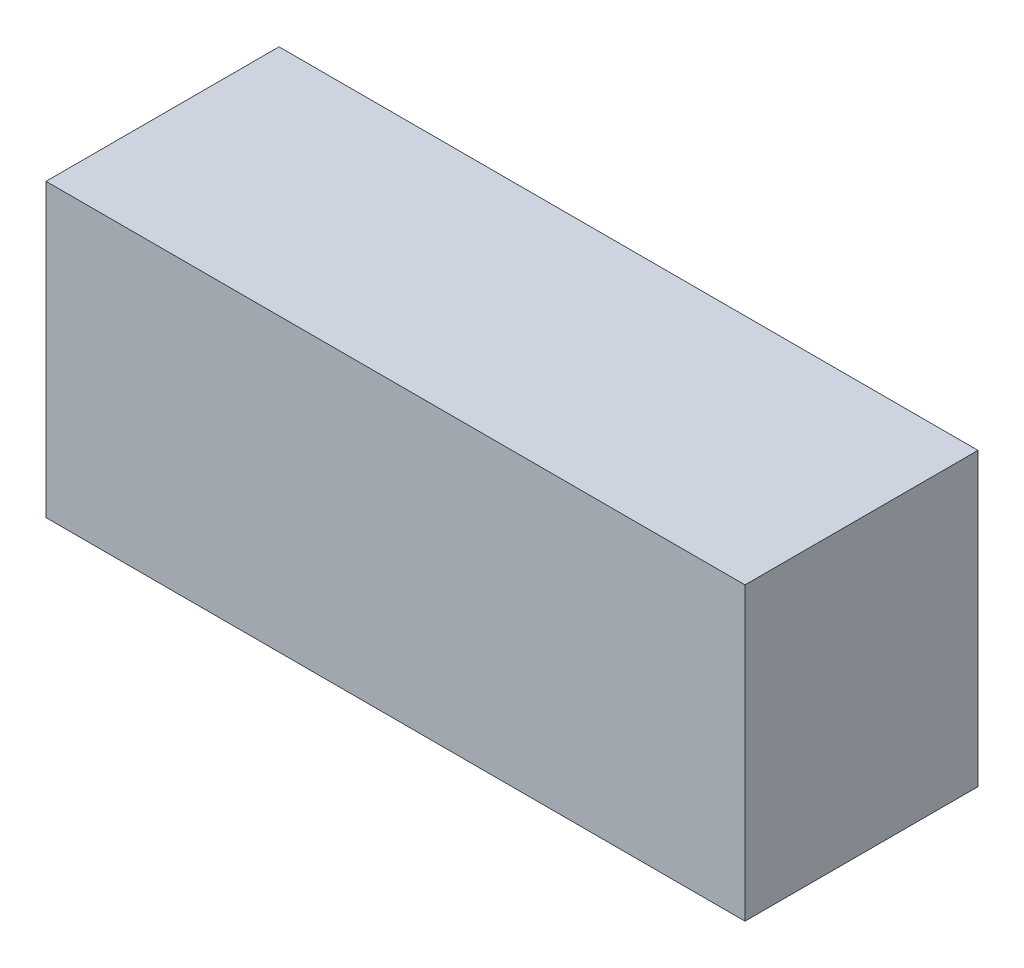
ISO-10303-21;
HEADER;
FILE_DESCRIPTION(('STEP AP214'),'2;1');
FILE_NAME('part.step','',(''),(''),'','','');
FILE_SCHEMA(('AUTOMOTIVE_DESIGN { 1 0 10303 214 1 1 1 1 }'));
ENDSEC;
DATA;
#1=APPLICATION_CONTEXT('core data for automotive mechanical design processes');
#2=APPLICATION_PROTOCOL_DEFINITION('international standard','automotive_design',2000,#1);
#3=PRODUCT_CONTEXT('',#1,'mechanical');
#4=PRODUCT('Part','Part','',(#3));
#5=PRODUCT_RELATED_PRODUCT_CATEGORY('part','',(#4));
#6=PRODUCT_DEFINITION_FORMATION('','',#4);
#7=PRODUCT_DEFINITION_CONTEXT('part definition',#1,'design');
#8=PRODUCT_DEFINITION('design','',#6,#7);
#9=PRODUCT_DEFINITION_SHAPE('','',#8);
#10=(LENGTH_UNIT() NAMED_UNIT(*) SI_UNIT(.MILLI.,.METRE.));
#11=(NAMED_UNIT(*) PLANE_ANGLE_UNIT() SI_UNIT($,.RADIAN.));
#12=(NAMED_UNIT(*) SI_UNIT($,.STERADIAN.) SOLID_ANGLE_UNIT());
#13=UNCERTAINTY_MEASURE_WITH_UNIT(LENGTH_MEASURE(1.E-05),#10,'distance_accuracy_value','');
#14=(GEOMETRIC_REPRESENTATION_CONTEXT(3) GLOBAL_UNCERTAINTY_ASSIGNED_CONTEXT((#13)) GLOBAL_UNIT_ASSIGNED_CONTEXT((#10,
#11,#12)) REPRESENTATION_CONTEXT('',''));
#15=CARTESIAN_POINT('',(0.,0.,0.));
#16=DIRECTION('',(0.,0.,1.));
#17=DIRECTION('',(1.,0.,0.));
#18=AXIS2_PLACEMENT_3D('',#15,#16,#17);
#19=CARTESIAN_POINT('',(19.05,15.875,6.35));
#20=DIRECTION('',(-1.,0.,0.));
#21=DIRECTION('',(0.,0.,1.));
#22=AXIS2_PLACEMENT_3D('',#19,#20,#21);
#23=PLANE('',#22);
#24=DIRECTION('',(0.,0.,-1.));
#25=VECTOR('',#24,1.);
#26=CARTESIAN_POINT('',(19.05,0.,6.35));
#27=LINE('',#26,#25);
#28=CARTESIAN_POINT('',(19.05,0.,6.35));
#29=VERTEX_POINT('',#28);
#30=CARTESIAN_POINT('',(19.05,0.,-6.35));
#31=VERTEX_POINT('',#30);
#32=EDGE_CURVE('E97',#29,#31,#27,.T.);
#33=ORIENTED_EDGE('',*,*,#32,.T.);
#34=DIRECTION('',(0.,-1.,0.));
#35=VECTOR('',#34,1.);
#36=CARTESIAN_POINT('',(19.05,15.875,-6.35));
#37=LINE('',#36,#35);
#38=CARTESIAN_POINT('',(19.05,15.875,-6.35));
#39=VERTEX_POINT('',#38);
#40=EDGE_CURVE('E11',#39,#31,#37,.T.);
#41=ORIENTED_EDGE('',*,*,#40,.F.);
#42=DIRECTION('',(0.,0.,-1.));
#43=VECTOR('',#42,1.);
#44=CARTESIAN_POINT('',(19.05,15.875,6.35));
#45=LINE('',#44,#43);
#46=CARTESIAN_POINT('',(19.05,15.875,6.35));
#47=VERTEX_POINT('',#46);
#48=EDGE_CURVE('E85',#47,#39,#45,.T.);
#49=ORIENTED_EDGE('',*,*,#48,.F.);
#50=DIRECTION('',(0.,-1.,0.));
#51=VECTOR('',#50,1.);
#52=CARTESIAN_POINT('',(19.05,15.875,6.35));
#53=LINE('',#52,#51);
#54=EDGE_CURVE('E93',#47,#29,#53,.T.);
#55=ORIENTED_EDGE('',*,*,#54,.T.);
#56=EDGE_LOOP('',(#33,#41,#49,#55));
#57=FACE_BOUND('',#56,.T.);
#58=ADVANCED_FACE('F34',(#57),#23,.F.);
#59=CARTESIAN_POINT('',(-19.05,15.875,-6.35));
#60=DIRECTION('',(0.,0.,1.));
#61=DIRECTION('',(1.,0.,0.));
#62=AXIS2_PLACEMENT_3D('',#59,#60,#61);
#63=PLANE('',#62);
#64=DIRECTION('',(-1.,0.,0.));
#65=VECTOR('',#64,1.);
#66=CARTESIAN_POINT('',(-19.05,0.,-6.35));
#67=LINE('',#66,#65);
#68=CARTESIAN_POINT('',(-19.05,0.,-6.35));
#69=VERTEX_POINT('',#68);
#70=EDGE_CURVE('E89',#31,#69,#67,.T.);
#71=ORIENTED_EDGE('',*,*,#70,.T.);
#72=DIRECTION('',(0.,-1.,0.));
#73=VECTOR('',#72,1.);
#74=CARTESIAN_POINT('',(-19.05,15.875,-6.35));
#75=LINE('',#74,#73);
#76=CARTESIAN_POINT('',(-19.05,15.875,-6.35));
#77=VERTEX_POINT('',#76);
#78=EDGE_CURVE('E42',#77,#69,#75,.T.);
#79=ORIENTED_EDGE('',*,*,#78,.F.);
#80=DIRECTION('',(-1.,0.,0.));
#81=VECTOR('',#80,1.);
#82=CARTESIAN_POINT('',(-19.05,15.875,-6.35));
#83=LINE('',#82,#81);
#84=EDGE_CURVE('E80',#39,#77,#83,.T.);
#85=ORIENTED_EDGE('',*,*,#84,.F.);
#86=ORIENTED_EDGE('',*,*,#40,.T.);
#87=EDGE_LOOP('',(#71,#79,#85,#86));
#88=FACE_BOUND('',#87,.T.);
#89=ADVANCED_FACE('F88',(#88),#63,.F.);
#90=CARTESIAN_POINT('',(-19.05,15.875,6.35));
#91=DIRECTION('',(1.,0.,0.));
#92=DIRECTION('',(0.,0.,-1.));
#93=AXIS2_PLACEMENT_3D('',#90,#91,#92);
#94=PLANE('',#93);
#95=DIRECTION('',(0.,0.,1.));
#96=VECTOR('',#95,1.);
#97=CARTESIAN_POINT('',(-19.05,0.,6.35));
#98=LINE('',#97,#96);
#99=CARTESIAN_POINT('',(-19.05,0.,6.35));
#100=VERTEX_POINT('',#99);
#101=EDGE_CURVE('E67',#69,#100,#98,.T.);
#102=ORIENTED_EDGE('',*,*,#101,.T.);
#103=DIRECTION('',(0.,-1.,0.));
#104=VECTOR('',#103,1.);
#105=CARTESIAN_POINT('',(-19.05,15.875,6.35));
#106=LINE('',#105,#104);
#107=CARTESIAN_POINT('',(-19.05,15.875,6.35));
#108=VERTEX_POINT('',#107);
#109=EDGE_CURVE('E90',#108,#100,#106,.T.);
#110=ORIENTED_EDGE('',*,*,#109,.F.);
#111=DIRECTION('',(0.,0.,1.));
#112=VECTOR('',#111,1.);
#113=CARTESIAN_POINT('',(-19.05,15.875,6.35));
#114=LINE('',#113,#112);
#115=EDGE_CURVE('E83',#77,#108,#114,.T.);
#116=ORIENTED_EDGE('',*,*,#115,.F.);
#117=ORIENTED_EDGE('',*,*,#78,.T.);
#118=EDGE_LOOP('',(#102,#110,#116,#117));
#119=FACE_BOUND('',#118,.T.);
#120=ADVANCED_FACE('F91',(#119),#94,.F.);
#121=CARTESIAN_POINT('',(-19.05,15.875,6.35));
#122=DIRECTION('',(0.,0.,-1.));
#123=DIRECTION('',(-1.,0.,0.));
#124=AXIS2_PLACEMENT_3D('',#121,#122,#123);
#125=PLANE('',#124);
#126=DIRECTION('',(1.,0.,0.));
#127=VECTOR('',#126,1.);
#128=CARTESIAN_POINT('',(-19.05,0.,6.35));
#129=LINE('',#128,#127);
#130=EDGE_CURVE('E73',#100,#29,#129,.T.);
#131=ORIENTED_EDGE('',*,*,#130,.T.);
#132=ORIENTED_EDGE('',*,*,#54,.F.);
#133=DIRECTION('',(1.,0.,0.));
#134=VECTOR('',#133,1.);
#135=CARTESIAN_POINT('',(-19.05,15.875,6.35));
#136=LINE('',#135,#134);
#137=EDGE_CURVE('E50',#108,#47,#136,.T.);
#138=ORIENTED_EDGE('',*,*,#137,.F.);
#139=ORIENTED_EDGE('',*,*,#109,.T.);
#140=EDGE_LOOP('',(#131,#132,#138,#139));
#141=FACE_BOUND('',#140,.T.);
#142=ADVANCED_FACE('F104',(#141),#125,.F.);
#143=CARTESIAN_POINT('',(0.,15.875,0.));
#144=DIRECTION('',(0.,-1.,0.));
#145=DIRECTION('',(0.,0.,-1.));
#146=AXIS2_PLACEMENT_3D('',#143,#144,#145);
#147=PLANE('',#146);
#148=ORIENTED_EDGE('',*,*,#48,.T.);
#149=ORIENTED_EDGE('',*,*,#84,.T.);
#150=ORIENTED_EDGE('',*,*,#115,.T.);
#151=ORIENTED_EDGE('',*,*,#137,.T.);
#152=EDGE_LOOP('',(#148,#149,#150,#151));
#153=FACE_BOUND('',#152,.T.);
#154=ADVANCED_FACE('F81',(#153),#147,.F.);
#155=CARTESIAN_POINT('',(0.,0.,0.));
#156=DIRECTION('',(0.,-1.,0.));
#157=DIRECTION('',(0.,0.,-1.));
#158=AXIS2_PLACEMENT_3D('',#155,#156,#157);
#159=PLANE('',#158);
#160=ORIENTED_EDGE('',*,*,#32,.F.);
#161=ORIENTED_EDGE('',*,*,#130,.F.);
#162=ORIENTED_EDGE('',*,*,#101,.F.);
#163=ORIENTED_EDGE('',*,*,#70,.F.);
#164=EDGE_LOOP('',(#160,#161,#162,#163));
#165=FACE_BOUND('',#164,.T.);
#166=ADVANCED_FACE('F107',(#165),#159,.T.);
#167=CLOSED_SHELL('',(#58,#89,#120,#142,#154,#166));
#168=MANIFOLD_SOLID_BREP('B2',#167);
#169=ADVANCED_BREP_SHAPE_REPRESENTATION('',(#18,#168),#14);
#170=SHAPE_DEFINITION_REPRESENTATION(#9,#169);
ENDSEC;
END-ISO-10303-21;
